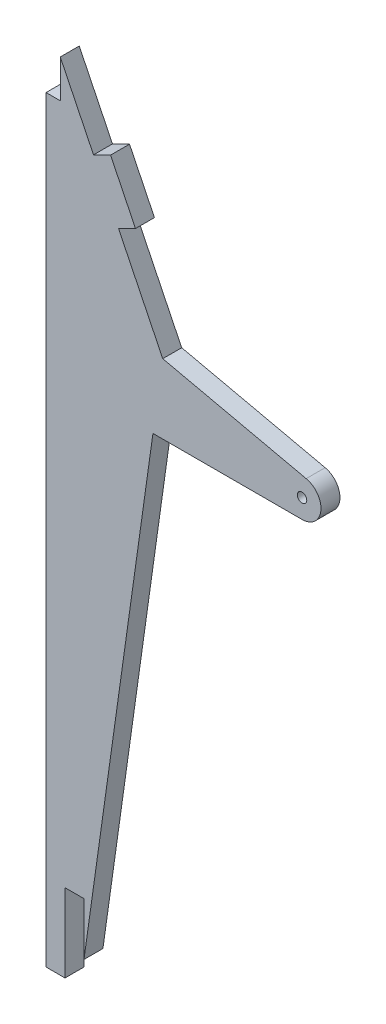
ISO-10303-21;
HEADER;
FILE_DESCRIPTION(('STEP AP214'),'2;1');
FILE_NAME('part.step','',(''),(''),'','','');
FILE_SCHEMA(('AUTOMOTIVE_DESIGN { 1 0 10303 214 1 1 1 1 }'));
ENDSEC;
DATA;
#1=APPLICATION_CONTEXT('core data for automotive mechanical design processes');
#2=APPLICATION_PROTOCOL_DEFINITION('international standard','automotive_design',2000,#1);
#3=PRODUCT_CONTEXT('',#1,'mechanical');
#4=PRODUCT('Part','Part','',(#3));
#5=PRODUCT_RELATED_PRODUCT_CATEGORY('part','',(#4));
#6=PRODUCT_DEFINITION_FORMATION('','',#4);
#7=PRODUCT_DEFINITION_CONTEXT('part definition',#1,'design');
#8=PRODUCT_DEFINITION('design','',#6,#7);
#9=PRODUCT_DEFINITION_SHAPE('','',#8);
#10=(LENGTH_UNIT() NAMED_UNIT(*) SI_UNIT(.MILLI.,.METRE.));
#11=(NAMED_UNIT(*) PLANE_ANGLE_UNIT() SI_UNIT($,.RADIAN.));
#12=(NAMED_UNIT(*) SI_UNIT($,.STERADIAN.) SOLID_ANGLE_UNIT());
#13=UNCERTAINTY_MEASURE_WITH_UNIT(LENGTH_MEASURE(1.E-05),#10,'distance_accuracy_value','');
#14=(GEOMETRIC_REPRESENTATION_CONTEXT(3) GLOBAL_UNCERTAINTY_ASSIGNED_CONTEXT((#13)) GLOBAL_UNIT_ASSIGNED_CONTEXT((#10,
#11,#12)) REPRESENTATION_CONTEXT('',''));
#15=CARTESIAN_POINT('',(0.,0.,0.));
#16=DIRECTION('',(0.,0.,1.));
#17=DIRECTION('',(1.,0.,0.));
#18=AXIS2_PLACEMENT_3D('',#15,#16,#17);
#19=CARTESIAN_POINT('',(1.63346951114756E-12,56.9522220641812,2.));
#20=DIRECTION('',(0.,-1.,0.));
#21=DIRECTION('',(1.,0.,0.));
#22=AXIS2_PLACEMENT_3D('',#19,#20,#21);
#23=PLANE('',#22);
#24=DIRECTION('',(-1.,0.,0.));
#25=VECTOR('',#24,1.);
#26=CARTESIAN_POINT('',(1.63346951114756E-12,56.9522220641812,0.));
#27=LINE('',#26,#25);
#28=CARTESIAN_POINT('',(35.2046806741437,56.9522220641802,0.));
#29=VERTEX_POINT('',#28);
#30=CARTESIAN_POINT('',(19.4792247982414,56.9522220641807,0.));
#31=VERTEX_POINT('',#30);
#32=EDGE_CURVE('E219',#29,#31,#27,.T.);
#33=ORIENTED_EDGE('',*,*,#32,.F.);
#34=DIRECTION('',(0.,0.,-1.));
#35=VECTOR('',#34,1.);
#36=CARTESIAN_POINT('',(35.2046806741437,56.9522220641802,2.));
#37=LINE('',#36,#35);
#38=CARTESIAN_POINT('',(35.2046806741437,56.9522220641802,2.));
#39=VERTEX_POINT('',#38);
#40=EDGE_CURVE('E11',#39,#29,#37,.T.);
#41=ORIENTED_EDGE('',*,*,#40,.F.);
#42=DIRECTION('',(-1.,0.,0.));
#43=VECTOR('',#42,1.);
#44=CARTESIAN_POINT('',(1.63346951114756E-12,56.9522220641812,2.));
#45=LINE('',#44,#43);
#46=CARTESIAN_POINT('',(19.4792247982414,56.9522220641807,2.));
#47=VERTEX_POINT('',#46);
#48=EDGE_CURVE('E330',#39,#47,#45,.T.);
#49=ORIENTED_EDGE('',*,*,#48,.T.);
#50=DIRECTION('',(0.,0.,-1.));
#51=VECTOR('',#50,1.);
#52=CARTESIAN_POINT('',(19.4792247982414,56.9522220641807,2.));
#53=LINE('',#52,#51);
#54=EDGE_CURVE('E111',#47,#31,#53,.T.);
#55=ORIENTED_EDGE('',*,*,#54,.T.);
#56=EDGE_LOOP('',(#33,#41,#49,#55));
#57=FACE_BOUND('',#56,.T.);
#58=ADVANCED_FACE('F36',(#57),#23,.T.);
#59=CARTESIAN_POINT('',(35.2046806741437,58.9522220641802,2.));
#60=DIRECTION('',(0.,0.,-1.));
#61=DIRECTION('',(-1.,0.,0.));
#62=AXIS2_PLACEMENT_3D('',#59,#60,#61);
#63=CYLINDRICAL_SURFACE('',#62,2.);
#64=CARTESIAN_POINT('',(35.2046806741437,58.9522220641802,0.));
#65=DIRECTION('',(0.,0.,1.));
#66=DIRECTION('',(1.,0.,0.));
#67=AXIS2_PLACEMENT_3D('',#64,#65,#66);
#68=CIRCLE('',#67,2.);
#69=CARTESIAN_POINT('',(35.6419002503171,60.90384678277,0.));
#70=VERTEX_POINT('',#69);
#71=EDGE_CURVE('E217',#29,#70,#68,.T.);
#72=ORIENTED_EDGE('',*,*,#71,.T.);
#73=DIRECTION('',(0.,0.,-1.));
#74=VECTOR('',#73,1.);
#75=CARTESIAN_POINT('',(35.6419002503171,60.90384678277,2.));
#76=LINE('',#75,#74);
#77=CARTESIAN_POINT('',(35.6419002503171,60.90384678277,2.));
#78=VERTEX_POINT('',#77);
#79=EDGE_CURVE('E45',#78,#70,#76,.T.);
#80=ORIENTED_EDGE('',*,*,#79,.F.);
#81=CARTESIAN_POINT('',(35.2046806741437,58.9522220641802,2.));
#82=DIRECTION('',(0.,0.,1.));
#83=DIRECTION('',(1.,0.,0.));
#84=AXIS2_PLACEMENT_3D('',#81,#82,#83);
#85=CIRCLE('',#84,2.);
#86=EDGE_CURVE('E332',#39,#78,#85,.T.);
#87=ORIENTED_EDGE('',*,*,#86,.F.);
#88=ORIENTED_EDGE('',*,*,#40,.T.);
#89=EDGE_LOOP('',(#72,#80,#87,#88));
#90=FACE_BOUND('',#89,.T.);
#91=ADVANCED_FACE('F218',(#90),#63,.T.);
#92=CARTESIAN_POINT('',(14.6954734556577,65.5964435501035,2.));
#93=DIRECTION('',(0.218609788086579,0.975812359294932,0.));
#94=DIRECTION('',(-0.975812359294932,0.218609788086579,0.));
#95=AXIS2_PLACEMENT_3D('',#92,#93,#94);
#96=PLANE('',#95);
#97=DIRECTION('',(0.975812359294932,-0.218609788086579,0.));
#98=VECTOR('',#97,1.);
#99=CARTESIAN_POINT('',(14.6954734556577,65.5964435501035,0.));
#100=LINE('',#99,#98);
#101=CARTESIAN_POINT('',(20.5123055143886,64.2933073358695,0.));
#102=VERTEX_POINT('',#101);
#103=EDGE_CURVE('E212',#102,#70,#100,.T.);
#104=ORIENTED_EDGE('',*,*,#103,.F.);
#105=DIRECTION('',(0.,0.,-1.));
#106=VECTOR('',#105,1.);
#107=CARTESIAN_POINT('',(20.5123055143886,64.2933073358695,2.));
#108=LINE('',#107,#106);
#109=CARTESIAN_POINT('',(20.5123055143886,64.2933073358695,2.));
#110=VERTEX_POINT('',#109);
#111=EDGE_CURVE('E204',#110,#102,#108,.T.);
#112=ORIENTED_EDGE('',*,*,#111,.F.);
#113=DIRECTION('',(0.975812359294932,-0.218609788086579,0.));
#114=VECTOR('',#113,1.);
#115=CARTESIAN_POINT('',(14.6954734556577,65.5964435501035,2.));
#116=LINE('',#115,#114);
#117=EDGE_CURVE('E214',#110,#78,#116,.T.);
#118=ORIENTED_EDGE('',*,*,#117,.T.);
#119=ORIENTED_EDGE('',*,*,#79,.T.);
#120=EDGE_LOOP('',(#104,#112,#118,#119));
#121=FACE_BOUND('',#120,.T.);
#122=ADVANCED_FACE('F210',(#121),#96,.T.);
#123=CARTESIAN_POINT('',(41.9023796776527,20.4371561072406,2.));
#124=DIRECTION('',(-0.898794046299256,-0.438371146788896,0.));
#125=DIRECTION('',(0.438371146788896,-0.898794046299256,0.));
#126=AXIS2_PLACEMENT_3D('',#123,#124,#125);
#127=PLANE('',#126);
#128=DIRECTION('',(-0.438371146788896,0.898794046299256,0.));
#129=VECTOR('',#128,1.);
#130=CARTESIAN_POINT('',(41.9023796776527,20.4371561072406,0.));
#131=LINE('',#130,#129);
#132=CARTESIAN_POINT('',(15.8418767291896,73.8691054159903,0.));
#133=VERTEX_POINT('',#132);
#134=EDGE_CURVE('E225',#102,#133,#131,.T.);
#135=ORIENTED_EDGE('',*,*,#134,.T.);
#136=DIRECTION('',(0.,0.,-1.));
#137=VECTOR('',#136,1.);
#138=CARTESIAN_POINT('',(15.8418767291896,73.8691054159903,2.));
#139=LINE('',#138,#137);
#140=CARTESIAN_POINT('',(15.8418767291896,73.8691054159903,2.));
#141=VERTEX_POINT('',#140);
#142=EDGE_CURVE('E202',#141,#133,#139,.T.);
#143=ORIENTED_EDGE('',*,*,#142,.F.);
#144=DIRECTION('',(-0.438371146788896,0.898794046299256,0.));
#145=VECTOR('',#144,1.);
#146=CARTESIAN_POINT('',(41.9023796776527,20.4371561072406,2.));
#147=LINE('',#146,#145);
#148=EDGE_CURVE('E337',#110,#141,#147,.T.);
#149=ORIENTED_EDGE('',*,*,#148,.F.);
#150=ORIENTED_EDGE('',*,*,#111,.T.);
#151=EDGE_LOOP('',(#135,#143,#149,#150));
#152=FACE_BOUND('',#151,.T.);
#153=ADVANCED_FACE('F272',(#152),#127,.F.);
#154=CARTESIAN_POINT('',(-26.0605029484642,53.4319493087474,2.));
#155=DIRECTION('',(0.438371146788927,-0.898794046299241,0.));
#156=DIRECTION('',(0.898794046299241,0.438371146788927,0.));
#157=AXIS2_PLACEMENT_3D('',#154,#155,#156);
#158=PLANE('',#157);
#159=DIRECTION('',(-0.898794046299241,-0.438371146788927,0.));
#160=VECTOR('',#159,1.);
#161=CARTESIAN_POINT('',(-26.0605029484642,53.4319493087474,0.));
#162=LINE('',#161,#160);
#163=CARTESIAN_POINT('',(17.6394648217865,74.7458477095675,0.));
#164=VERTEX_POINT('',#163);
#165=EDGE_CURVE('E227',#164,#133,#162,.T.);
#166=ORIENTED_EDGE('',*,*,#165,.F.);
#167=DIRECTION('',(0.,0.,-1.));
#168=VECTOR('',#167,1.);
#169=CARTESIAN_POINT('',(17.6394648217865,74.7458477095675,2.));
#170=LINE('',#169,#168);
#171=CARTESIAN_POINT('',(17.6394648217865,74.7458477095675,2.));
#172=VERTEX_POINT('',#171);
#173=EDGE_CURVE('E200',#172,#164,#170,.T.);
#174=ORIENTED_EDGE('',*,*,#173,.F.);
#175=DIRECTION('',(-0.898794046299241,-0.438371146788927,0.));
#176=VECTOR('',#175,1.);
#177=CARTESIAN_POINT('',(-26.0605029484642,53.4319493087474,2.));
#178=LINE('',#177,#176);
#179=EDGE_CURVE('E339',#172,#141,#178,.T.);
#180=ORIENTED_EDGE('',*,*,#179,.T.);
#181=ORIENTED_EDGE('',*,*,#142,.T.);
#182=EDGE_LOOP('',(#166,#174,#180,#181));
#183=FACE_BOUND('',#182,.T.);
#184=ADVANCED_FACE('F275',(#183),#158,.T.);
#185=CARTESIAN_POINT('',(43.6999677702574,21.3138984008344,2.));
#186=DIRECTION('',(0.89879404629915,0.438371146789112,0.));
#187=DIRECTION('',(-0.438371146789112,0.89879404629915,0.));
#188=AXIS2_PLACEMENT_3D('',#185,#186,#187);
#189=PLANE('',#188);
#190=DIRECTION('',(0.438371146789112,-0.89879404629915,0.));
#191=VECTOR('',#190,1.);
#192=CARTESIAN_POINT('',(43.6999677702574,21.3138984008344,0.));
#193=LINE('',#192,#191);
#194=CARTESIAN_POINT('',(15.0092379410517,80.1386119873628,0.));
#195=VERTEX_POINT('',#194);
#196=EDGE_CURVE('E232',#195,#164,#193,.T.);
#197=ORIENTED_EDGE('',*,*,#196,.F.);
#198=DIRECTION('',(0.,0.,-1.));
#199=VECTOR('',#198,1.);
#200=CARTESIAN_POINT('',(15.0092379410517,80.1386119873628,2.));
#201=LINE('',#200,#199);
#202=CARTESIAN_POINT('',(15.0092379410517,80.1386119873628,2.));
#203=VERTEX_POINT('',#202);
#204=EDGE_CURVE('E198',#203,#195,#201,.T.);
#205=ORIENTED_EDGE('',*,*,#204,.F.);
#206=DIRECTION('',(0.438371146789112,-0.89879404629915,0.));
#207=VECTOR('',#206,1.);
#208=CARTESIAN_POINT('',(43.6999677702574,21.3138984008344,2.));
#209=LINE('',#208,#207);
#210=EDGE_CURVE('E342',#203,#172,#209,.T.);
#211=ORIENTED_EDGE('',*,*,#210,.T.);
#212=ORIENTED_EDGE('',*,*,#173,.T.);
#213=EDGE_LOOP('',(#197,#205,#211,#212));
#214=FACE_BOUND('',#213,.T.);
#215=ADVANCED_FACE('F279',(#214),#189,.T.);
#216=CARTESIAN_POINT('',(-28.6907298291977,58.8247135865438,2.));
#217=DIRECTION('',(-0.43837114678892,0.898794046299244,0.));
#218=DIRECTION('',(-0.898794046299244,-0.43837114678892,0.));
#219=AXIS2_PLACEMENT_3D('',#216,#217,#218);
#220=PLANE('',#219);
#221=DIRECTION('',(0.898794046299244,0.43837114678892,0.));
#222=VECTOR('',#221,1.);
#223=CARTESIAN_POINT('',(-28.6907298291977,58.8247135865438,0.));
#224=LINE('',#223,#222);
#225=CARTESIAN_POINT('',(13.2116498484556,79.2618696937862,0.));
#226=VERTEX_POINT('',#225);
#227=EDGE_CURVE('E235',#226,#195,#224,.T.);
#228=ORIENTED_EDGE('',*,*,#227,.F.);
#229=DIRECTION('',(0.,0.,-1.));
#230=VECTOR('',#229,1.);
#231=CARTESIAN_POINT('',(13.2116498484556,79.2618696937862,2.));
#232=LINE('',#231,#230);
#233=CARTESIAN_POINT('',(13.2116498484556,79.2618696937862,2.));
#234=VERTEX_POINT('',#233);
#235=EDGE_CURVE('E196',#234,#226,#232,.T.);
#236=ORIENTED_EDGE('',*,*,#235,.F.);
#237=DIRECTION('',(0.898794046299244,0.43837114678892,0.));
#238=VECTOR('',#237,1.);
#239=CARTESIAN_POINT('',(-28.6907298291977,58.8247135865438,2.));
#240=LINE('',#239,#238);
#241=EDGE_CURVE('E345',#234,#203,#240,.T.);
#242=ORIENTED_EDGE('',*,*,#241,.T.);
#243=ORIENTED_EDGE('',*,*,#204,.T.);
#244=EDGE_LOOP('',(#228,#236,#242,#243));
#245=FACE_BOUND('',#244,.T.);
#246=ADVANCED_FACE('F283',(#245),#220,.T.);
#247=CARTESIAN_POINT('',(41.9023796776566,20.4371561072484,2.));
#248=DIRECTION('',(-0.898794046299206,-0.438371146788997,0.));
#249=DIRECTION('',(0.438371146788997,-0.898794046299206,0.));
#250=AXIS2_PLACEMENT_3D('',#247,#248,#249);
#251=PLANE('',#250);
#252=DIRECTION('',(-0.438371146788997,0.898794046299206,0.));
#253=VECTOR('',#252,1.);
#254=CARTESIAN_POINT('',(41.9023796776566,20.4371561072484,0.));
#255=LINE('',#254,#253);
#256=CARTESIAN_POINT('',(9.70468067414368,86.4522220641798,0.));
#257=VERTEX_POINT('',#256);
#258=EDGE_CURVE('E238',#226,#257,#255,.T.);
#259=ORIENTED_EDGE('',*,*,#258,.T.);
#260=DIRECTION('',(0.,0.,-1.));
#261=VECTOR('',#260,1.);
#262=CARTESIAN_POINT('',(9.70468067414368,86.4522220641798,2.));
#263=LINE('',#262,#261);
#264=CARTESIAN_POINT('',(9.70468067414368,86.4522220641798,2.));
#265=VERTEX_POINT('',#264);
#266=EDGE_CURVE('E193',#265,#257,#263,.T.);
#267=ORIENTED_EDGE('',*,*,#266,.F.);
#268=DIRECTION('',(-0.438371146788997,0.898794046299206,0.));
#269=VECTOR('',#268,1.);
#270=CARTESIAN_POINT('',(41.9023796776566,20.4371561072484,2.));
#271=LINE('',#270,#269);
#272=EDGE_CURVE('E348',#234,#265,#271,.T.);
#273=ORIENTED_EDGE('',*,*,#272,.F.);
#274=ORIENTED_EDGE('',*,*,#235,.T.);
#275=EDGE_LOOP('',(#259,#267,#273,#274));
#276=FACE_BOUND('',#275,.T.);
#277=ADVANCED_FACE('F287',(#276),#251,.F.);
#278=CARTESIAN_POINT('',(9.70468067414368,0.,2.));
#279=DIRECTION('',(1.,0.,0.));
#280=DIRECTION('',(0.,0.,-1.));
#281=AXIS2_PLACEMENT_3D('',#278,#279,#280);
#282=PLANE('',#281);
#283=DIRECTION('',(0.,-1.,0.));
#284=VECTOR('',#283,1.);
#285=CARTESIAN_POINT('',(9.70468067414368,0.,0.));
#286=LINE('',#285,#284);
#287=CARTESIAN_POINT('',(9.70468067414368,82.4522220641798,0.));
#288=VERTEX_POINT('',#287);
#289=EDGE_CURVE('E241',#257,#288,#286,.T.);
#290=ORIENTED_EDGE('',*,*,#289,.T.);
#291=DIRECTION('',(0.,0.,-1.));
#292=VECTOR('',#291,1.);
#293=CARTESIAN_POINT('',(9.70468067414368,82.4522220641798,2.));
#294=LINE('',#293,#292);
#295=CARTESIAN_POINT('',(9.70468067414368,82.4522220641798,2.));
#296=VERTEX_POINT('',#295);
#297=EDGE_CURVE('E190',#296,#288,#294,.T.);
#298=ORIENTED_EDGE('',*,*,#297,.F.);
#299=DIRECTION('',(0.,-1.,0.));
#300=VECTOR('',#299,1.);
#301=CARTESIAN_POINT('',(9.70468067414368,0.,2.));
#302=LINE('',#301,#300);
#303=EDGE_CURVE('E351',#265,#296,#302,.T.);
#304=ORIENTED_EDGE('',*,*,#303,.F.);
#305=ORIENTED_EDGE('',*,*,#266,.T.);
#306=EDGE_LOOP('',(#290,#298,#304,#305));
#307=FACE_BOUND('',#306,.T.);
#308=ADVANCED_FACE('F291',(#307),#282,.F.);
#309=CARTESIAN_POINT('',(0.,82.4522220641798,2.));
#310=DIRECTION('',(0.,-1.,0.));
#311=DIRECTION('',(0.,0.,-1.));
#312=AXIS2_PLACEMENT_3D('',#309,#310,#311);
#313=PLANE('',#312);
#314=DIRECTION('',(-1.,0.,0.));
#315=VECTOR('',#314,1.);
#316=CARTESIAN_POINT('',(0.,82.4522220641798,0.));
#317=LINE('',#316,#315);
#318=CARTESIAN_POINT('',(8.20468067414368,82.4522220641798,0.));
#319=VERTEX_POINT('',#318);
#320=EDGE_CURVE('E244',#288,#319,#317,.T.);
#321=ORIENTED_EDGE('',*,*,#320,.T.);
#322=DIRECTION('',(0.,0.,-1.));
#323=VECTOR('',#322,1.);
#324=CARTESIAN_POINT('',(8.20468067414368,82.4522220641798,2.));
#325=LINE('',#324,#323);
#326=CARTESIAN_POINT('',(8.20468067414368,82.4522220641798,2.));
#327=VERTEX_POINT('',#326);
#328=EDGE_CURVE('E187',#327,#319,#325,.T.);
#329=ORIENTED_EDGE('',*,*,#328,.F.);
#330=DIRECTION('',(-1.,0.,0.));
#331=VECTOR('',#330,1.);
#332=CARTESIAN_POINT('',(0.,82.4522220641798,2.));
#333=LINE('',#332,#331);
#334=EDGE_CURVE('E354',#296,#327,#333,.T.);
#335=ORIENTED_EDGE('',*,*,#334,.F.);
#336=ORIENTED_EDGE('',*,*,#297,.T.);
#337=EDGE_LOOP('',(#321,#329,#335,#336));
#338=FACE_BOUND('',#337,.T.);
#339=ADVANCED_FACE('F295',(#338),#313,.F.);
#340=CARTESIAN_POINT('',(8.20468067414368,0.,2.));
#341=DIRECTION('',(1.,0.,0.));
#342=DIRECTION('',(0.,0.,-1.));
#343=AXIS2_PLACEMENT_3D('',#340,#341,#342);
#344=PLANE('',#343);
#345=DIRECTION('',(0.,-1.,0.));
#346=VECTOR('',#345,1.);
#347=CARTESIAN_POINT('',(8.20468067414368,0.,0.));
#348=LINE('',#347,#346);
#349=CARTESIAN_POINT('',(8.20468067414368,2.5695053038794,0.));
#350=VERTEX_POINT('',#349);
#351=EDGE_CURVE('E247',#319,#350,#348,.T.);
#352=ORIENTED_EDGE('',*,*,#351,.T.);
#353=DIRECTION('',(0.,0.,-1.));
#354=VECTOR('',#353,1.);
#355=CARTESIAN_POINT('',(8.20468067414368,2.5695053038794,2.));
#356=LINE('',#355,#354);
#357=CARTESIAN_POINT('',(8.20468067414368,2.5695053038794,2.));
#358=VERTEX_POINT('',#357);
#359=EDGE_CURVE('E184',#358,#350,#356,.T.);
#360=ORIENTED_EDGE('',*,*,#359,.F.);
#361=DIRECTION('',(0.,-1.,0.));
#362=VECTOR('',#361,1.);
#363=CARTESIAN_POINT('',(8.20468067414368,0.,2.));
#364=LINE('',#363,#362);
#365=EDGE_CURVE('E357',#327,#358,#364,.T.);
#366=ORIENTED_EDGE('',*,*,#365,.F.);
#367=ORIENTED_EDGE('',*,*,#328,.T.);
#368=EDGE_LOOP('',(#352,#360,#366,#367));
#369=FACE_BOUND('',#368,.T.);
#370=ADVANCED_FACE('F299',(#369),#344,.F.);
#371=CARTESIAN_POINT('',(0.,2.5695053038794,2.));
#372=DIRECTION('',(0.,1.,0.));
#373=DIRECTION('',(0.,0.,1.));
#374=AXIS2_PLACEMENT_3D('',#371,#372,#373);
#375=PLANE('',#374);
#376=DIRECTION('',(1.,0.,0.));
#377=VECTOR('',#376,1.);
#378=CARTESIAN_POINT('',(0.,2.5695053038794,0.));
#379=LINE('',#378,#377);
#380=CARTESIAN_POINT('',(10.2046806741437,2.5695053038794,0.));
#381=VERTEX_POINT('',#380);
#382=EDGE_CURVE('E250',#350,#381,#379,.T.);
#383=ORIENTED_EDGE('',*,*,#382,.T.);
#384=DIRECTION('',(0.,0.,-1.));
#385=VECTOR('',#384,1.);
#386=CARTESIAN_POINT('',(10.2046806741437,2.5695053038794,2.));
#387=LINE('',#386,#385);
#388=CARTESIAN_POINT('',(10.2046806741437,2.5695053038794,2.));
#389=VERTEX_POINT('',#388);
#390=EDGE_CURVE('E177',#389,#381,#387,.T.);
#391=ORIENTED_EDGE('',*,*,#390,.F.);
#392=DIRECTION('',(1.,0.,0.));
#393=VECTOR('',#392,1.);
#394=CARTESIAN_POINT('',(0.,2.5695053038794,2.));
#395=LINE('',#394,#393);
#396=EDGE_CURVE('E360',#358,#389,#395,.T.);
#397=ORIENTED_EDGE('',*,*,#396,.F.);
#398=ORIENTED_EDGE('',*,*,#359,.T.);
#399=EDGE_LOOP('',(#383,#391,#397,#398));
#400=FACE_BOUND('',#399,.T.);
#401=ADVANCED_FACE('F303',(#400),#375,.F.);
#402=CARTESIAN_POINT('',(10.2046806741437,0.,2.));
#403=DIRECTION('',(-1.,0.,0.));
#404=DIRECTION('',(0.,0.,1.));
#405=AXIS2_PLACEMENT_3D('',#402,#403,#404);
#406=PLANE('',#405);
#407=DIRECTION('',(0.,1.,0.));
#408=VECTOR('',#407,1.);
#409=CARTESIAN_POINT('',(10.2046806741437,0.,0.));
#410=LINE('',#409,#408);
#411=CARTESIAN_POINT('',(10.2046806741437,10.8195053038794,0.));
#412=VERTEX_POINT('',#411);
#413=EDGE_CURVE('E253',#381,#412,#410,.T.);
#414=ORIENTED_EDGE('',*,*,#413,.T.);
#415=DIRECTION('',(0.,0.,-1.));
#416=VECTOR('',#415,1.);
#417=CARTESIAN_POINT('',(10.2046806741437,10.8195053038794,2.));
#418=LINE('',#417,#416);
#419=CARTESIAN_POINT('',(10.2046806741437,10.8195053038794,2.));
#420=VERTEX_POINT('',#419);
#421=EDGE_CURVE('E175',#420,#412,#418,.T.);
#422=ORIENTED_EDGE('',*,*,#421,.F.);
#423=DIRECTION('',(0.,1.,0.));
#424=VECTOR('',#423,1.);
#425=CARTESIAN_POINT('',(10.2046806741437,0.,2.));
#426=LINE('',#425,#424);
#427=EDGE_CURVE('E168',#389,#420,#426,.T.);
#428=ORIENTED_EDGE('',*,*,#427,.F.);
#429=ORIENTED_EDGE('',*,*,#390,.T.);
#430=EDGE_LOOP('',(#414,#422,#428,#429));
#431=FACE_BOUND('',#430,.T.);
#432=ADVANCED_FACE('F307',(#431),#406,.F.);
#433=CARTESIAN_POINT('',(0.,10.8195053038794,2.));
#434=DIRECTION('',(0.,1.,0.));
#435=DIRECTION('',(0.,0.,1.));
#436=AXIS2_PLACEMENT_3D('',#433,#434,#435);
#437=PLANE('',#436);
#438=DIRECTION('',(1.,0.,0.));
#439=VECTOR('',#438,1.);
#440=CARTESIAN_POINT('',(0.,10.8195053038794,0.));
#441=LINE('',#440,#439);
#442=CARTESIAN_POINT('',(12.2046806741437,10.8195053038794,0.));
#443=VERTEX_POINT('',#442);
#444=EDGE_CURVE('E174',#412,#443,#441,.T.);
#445=ORIENTED_EDGE('',*,*,#444,.T.);
#446=DIRECTION('',(0.,0.,-1.));
#447=VECTOR('',#446,1.);
#448=CARTESIAN_POINT('',(12.2046806741437,10.8195053038794,2.));
#449=LINE('',#448,#447);
#450=CARTESIAN_POINT('',(12.2046806741437,10.8195053038794,2.));
#451=VERTEX_POINT('',#450);
#452=EDGE_CURVE('E160',#451,#443,#449,.T.);
#453=ORIENTED_EDGE('',*,*,#452,.F.);
#454=DIRECTION('',(1.,0.,0.));
#455=VECTOR('',#454,1.);
#456=CARTESIAN_POINT('',(0.,10.8195053038794,2.));
#457=LINE('',#456,#455);
#458=EDGE_CURVE('E163',#420,#451,#457,.T.);
#459=ORIENTED_EDGE('',*,*,#458,.F.);
#460=ORIENTED_EDGE('',*,*,#421,.T.);
#461=EDGE_LOOP('',(#445,#453,#459,#460));
#462=FACE_BOUND('',#461,.T.);
#463=ADVANCED_FACE('F173',(#462),#437,.F.);
#464=CARTESIAN_POINT('',(12.2046806741437,0.,2.));
#465=DIRECTION('',(1.,0.,0.));
#466=DIRECTION('',(0.,0.,-1.));
#467=AXIS2_PLACEMENT_3D('',#464,#465,#466);
#468=PLANE('',#467);
#469=DIRECTION('',(0.,-1.,0.));
#470=VECTOR('',#469,1.);
#471=CARTESIAN_POINT('',(12.2046806741437,0.,0.));
#472=LINE('',#471,#470);
#473=CARTESIAN_POINT('',(12.2046806741437,5.25921502905203,0.));
#474=VERTEX_POINT('',#473);
#475=EDGE_CURVE('E257',#443,#474,#472,.T.);
#476=ORIENTED_EDGE('',*,*,#475,.T.);
#477=DIRECTION('',(0.,0.,-1.));
#478=VECTOR('',#477,1.);
#479=CARTESIAN_POINT('',(12.2046806741437,5.25921502905203,2.));
#480=LINE('',#479,#478);
#481=CARTESIAN_POINT('',(12.2046806741437,5.25921502905203,2.));
#482=VERTEX_POINT('',#481);
#483=EDGE_CURVE('E162',#482,#474,#480,.T.);
#484=ORIENTED_EDGE('',*,*,#483,.F.);
#485=DIRECTION('',(0.,-1.,0.));
#486=VECTOR('',#485,1.);
#487=CARTESIAN_POINT('',(12.2046806741437,0.,2.));
#488=LINE('',#487,#486);
#489=EDGE_CURVE('E155',#451,#482,#488,.T.);
#490=ORIENTED_EDGE('',*,*,#489,.F.);
#491=ORIENTED_EDGE('',*,*,#452,.T.);
#492=EDGE_LOOP('',(#476,#484,#490,#491));
#493=FACE_BOUND('',#492,.T.);
#494=ADVANCED_FACE('F158',(#493),#468,.F.);
#495=CARTESIAN_POINT('',(35.2046806741437,58.9522220641802,2.));
#496=DIRECTION('',(0.,0.,-1.));
#497=DIRECTION('',(-1.,0.,0.));
#498=AXIS2_PLACEMENT_3D('',#495,#496,#497);
#499=CYLINDRICAL_SURFACE('',#498,0.5);
#500=CARTESIAN_POINT('',(35.2046806741437,58.9522220641802,2.));
#501=DIRECTION('',(0.,0.,1.));
#502=DIRECTION('',(1.,0.,0.));
#503=AXIS2_PLACEMENT_3D('',#500,#501,#502);
#504=CIRCLE('',#503,0.5);
#505=CARTESIAN_POINT('',(35.7046806741437,58.9522220641802,2.));
#506=VERTEX_POINT('',#505);
#507=EDGE_CURVE('E259',#506,#506,#504,.T.);
#508=ORIENTED_EDGE('',*,*,#507,.T.);
#509=EDGE_LOOP('',(#508));
#510=FACE_BOUND('',#509,.T.);
#511=CARTESIAN_POINT('',(35.2046806741437,58.9522220641802,0.));
#512=DIRECTION('',(0.,0.,1.));
#513=DIRECTION('',(1.,0.,0.));
#514=AXIS2_PLACEMENT_3D('',#511,#512,#513);
#515=CIRCLE('',#514,0.5);
#516=CARTESIAN_POINT('',(35.7046806741437,58.9522220641802,0.));
#517=VERTEX_POINT('',#516);
#518=EDGE_CURVE('E262',#517,#517,#515,.T.);
#519=ORIENTED_EDGE('',*,*,#518,.F.);
#520=EDGE_LOOP('',(#519));
#521=FACE_BOUND('',#520,.T.);
#522=ADVANCED_FACE('F38',(#510,#521),#499,.F.);
#523=CARTESIAN_POINT('',(11.2419401413167,-1.58203196697184,2.));
#524=DIRECTION('',(-0.990242797995727,0.139352793361288,0.));
#525=DIRECTION('',(-0.139352793361288,-0.990242797995727,0.));
#526=AXIS2_PLACEMENT_3D('',#523,#524,#525);
#527=PLANE('',#526);
#528=DIRECTION('',(0.139352793361288,0.990242797995727,0.));
#529=VECTOR('',#528,1.);
#530=CARTESIAN_POINT('',(11.2419401413167,-1.58203196697184,0.));
#531=LINE('',#530,#529);
#532=EDGE_CURVE('E104',#474,#31,#531,.T.);
#533=ORIENTED_EDGE('',*,*,#532,.T.);
#534=ORIENTED_EDGE('',*,*,#54,.F.);
#535=DIRECTION('',(0.139352793361288,0.990242797995727,0.));
#536=VECTOR('',#535,1.);
#537=CARTESIAN_POINT('',(11.2419401413167,-1.58203196697184,2.));
#538=LINE('',#537,#536);
#539=EDGE_CURVE('E53',#482,#47,#538,.T.);
#540=ORIENTED_EDGE('',*,*,#539,.F.);
#541=ORIENTED_EDGE('',*,*,#483,.T.);
#542=EDGE_LOOP('',(#533,#534,#540,#541));
#543=FACE_BOUND('',#542,.T.);
#544=ADVANCED_FACE('F316',(#543),#527,.F.);
#545=CARTESIAN_POINT('',(0.,0.,2.));
#546=DIRECTION('',(0.,0.,1.));
#547=DIRECTION('',(1.,0.,0.));
#548=AXIS2_PLACEMENT_3D('',#545,#546,#547);
#549=PLANE('',#548);
#550=ORIENTED_EDGE('',*,*,#507,.F.);
#551=EDGE_LOOP('',(#550));
#552=FACE_BOUND('',#551,.T.);
#553=ORIENTED_EDGE('',*,*,#48,.F.);
#554=ORIENTED_EDGE('',*,*,#86,.T.);
#555=ORIENTED_EDGE('',*,*,#117,.F.);
#556=ORIENTED_EDGE('',*,*,#148,.T.);
#557=ORIENTED_EDGE('',*,*,#179,.F.);
#558=ORIENTED_EDGE('',*,*,#210,.F.);
#559=ORIENTED_EDGE('',*,*,#241,.F.);
#560=ORIENTED_EDGE('',*,*,#272,.T.);
#561=ORIENTED_EDGE('',*,*,#303,.T.);
#562=ORIENTED_EDGE('',*,*,#334,.T.);
#563=ORIENTED_EDGE('',*,*,#365,.T.);
#564=ORIENTED_EDGE('',*,*,#396,.T.);
#565=ORIENTED_EDGE('',*,*,#427,.T.);
#566=ORIENTED_EDGE('',*,*,#458,.T.);
#567=ORIENTED_EDGE('',*,*,#489,.T.);
#568=ORIENTED_EDGE('',*,*,#539,.T.);
#569=EDGE_LOOP('',(#553,#554,#555,#556,#557,#558,#559,#560,#561,#562,#563,#564,#565,#566,#567,#568));
#570=FACE_BOUND('',#569,.T.);
#571=ADVANCED_FACE('F166',(#552,#570),#549,.T.);
#572=CARTESIAN_POINT('',(0.,0.,0.));
#573=DIRECTION('',(0.,0.,1.));
#574=DIRECTION('',(1.,0.,0.));
#575=AXIS2_PLACEMENT_3D('',#572,#573,#574);
#576=PLANE('',#575);
#577=ORIENTED_EDGE('',*,*,#518,.T.);
#578=EDGE_LOOP('',(#577));
#579=FACE_BOUND('',#578,.T.);
#580=ORIENTED_EDGE('',*,*,#32,.T.);
#581=ORIENTED_EDGE('',*,*,#532,.F.);
#582=ORIENTED_EDGE('',*,*,#475,.F.);
#583=ORIENTED_EDGE('',*,*,#444,.F.);
#584=ORIENTED_EDGE('',*,*,#413,.F.);
#585=ORIENTED_EDGE('',*,*,#382,.F.);
#586=ORIENTED_EDGE('',*,*,#351,.F.);
#587=ORIENTED_EDGE('',*,*,#320,.F.);
#588=ORIENTED_EDGE('',*,*,#289,.F.);
#589=ORIENTED_EDGE('',*,*,#258,.F.);
#590=ORIENTED_EDGE('',*,*,#227,.T.);
#591=ORIENTED_EDGE('',*,*,#196,.T.);
#592=ORIENTED_EDGE('',*,*,#165,.T.);
#593=ORIENTED_EDGE('',*,*,#134,.F.);
#594=ORIENTED_EDGE('',*,*,#103,.T.);
#595=ORIENTED_EDGE('',*,*,#71,.F.);
#596=EDGE_LOOP('',(#580,#581,#582,#583,#584,#585,#586,#587,#588,#589,#590,#591,#592,#593,#594,#595));
#597=FACE_BOUND('',#596,.T.);
#598=ADVANCED_FACE('F222',(#579,#597),#576,.F.);
#599=CLOSED_SHELL('',(#58,#91,#122,#153,#184,#215,#246,#277,#308,#339,#370,#401,#432,#463,#494,
#522,#544,#571,#598));
#600=MANIFOLD_SOLID_BREP('B2',#599);
#601=ADVANCED_BREP_SHAPE_REPRESENTATION('',(#18,#600),#14);
#602=SHAPE_DEFINITION_REPRESENTATION(#9,#601);
ENDSEC;
END-ISO-10303-21;
